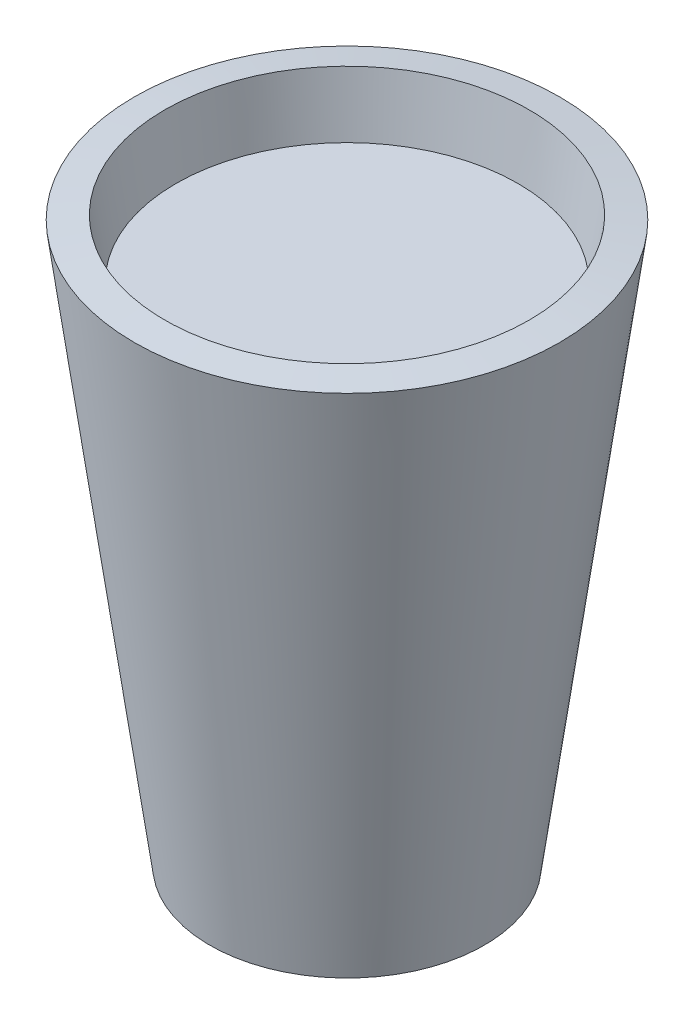
ISO-10303-21;
HEADER;
FILE_DESCRIPTION(('STEP AP214'),'2;1');
FILE_NAME('part.step','',(''),(''),'','','');
FILE_SCHEMA(('AUTOMOTIVE_DESIGN { 1 0 10303 214 1 1 1 1 }'));
ENDSEC;
DATA;
#1=APPLICATION_CONTEXT('core data for automotive mechanical design processes');
#2=APPLICATION_PROTOCOL_DEFINITION('international standard','automotive_design',2000,#1);
#3=PRODUCT_CONTEXT('',#1,'mechanical');
#4=PRODUCT('Part','Part','',(#3));
#5=PRODUCT_RELATED_PRODUCT_CATEGORY('part','',(#4));
#6=PRODUCT_DEFINITION_FORMATION('','',#4);
#7=PRODUCT_DEFINITION_CONTEXT('part definition',#1,'design');
#8=PRODUCT_DEFINITION('design','',#6,#7);
#9=PRODUCT_DEFINITION_SHAPE('','',#8);
#10=(LENGTH_UNIT() NAMED_UNIT(*) SI_UNIT(.MILLI.,.METRE.));
#11=(NAMED_UNIT(*) PLANE_ANGLE_UNIT() SI_UNIT($,.RADIAN.));
#12=(NAMED_UNIT(*) SI_UNIT($,.STERADIAN.) SOLID_ANGLE_UNIT());
#13=UNCERTAINTY_MEASURE_WITH_UNIT(LENGTH_MEASURE(1.E-05),#10,'distance_accuracy_value','');
#14=(GEOMETRIC_REPRESENTATION_CONTEXT(3) GLOBAL_UNCERTAINTY_ASSIGNED_CONTEXT((#13)) GLOBAL_UNIT_ASSIGNED_CONTEXT((#10,
#11,#12)) REPRESENTATION_CONTEXT('',''));
#15=CARTESIAN_POINT('',(0.,0.,0.));
#16=DIRECTION('',(0.,0.,1.));
#17=DIRECTION('',(1.,0.,0.));
#18=AXIS2_PLACEMENT_3D('',#15,#16,#17);
#19=CARTESIAN_POINT('',(0.,0.,0.));
#20=DIRECTION('',(0.,1.,0.));
#21=DIRECTION('',(-1.,0.,0.));
#22=AXIS2_PLACEMENT_3D('',#19,#20,#21);
#23=PLANE('',#22);
#24=CARTESIAN_POINT('',(0.,0.,0.));
#25=DIRECTION('',(0.,1.,0.));
#26=DIRECTION('',(-1.,0.,0.));
#27=AXIS2_PLACEMENT_3D('',#24,#25,#26);
#28=CIRCLE('',#27,28.575);
#29=CARTESIAN_POINT('',(-28.575,0.,0.));
#30=VERTEX_POINT('',#29);
#31=EDGE_CURVE('E10',#30,#30,#28,.T.);
#32=ORIENTED_EDGE('',*,*,#31,.F.);
#33=EDGE_LOOP('',(#32));
#34=FACE_BOUND('',#33,.T.);
#35=ADVANCED_FACE('F31',(#34),#23,.F.);
#36=CARTESIAN_POINT('',(0.,0.,0.));
#37=DIRECTION('',(0.,1.,0.));
#38=DIRECTION('',(-1.,0.,0.));
#39=AXIS2_PLACEMENT_3D('',#36,#37,#38);
#40=CONICAL_SURFACE('',#39,28.575,0.133853680848105);
#41=CARTESIAN_POINT('',(0.,116.424181846119,0.));
#42=DIRECTION('',(0.,1.,0.));
#43=DIRECTION('',(-1.,0.,0.));
#44=AXIS2_PLACEMENT_3D('',#41,#42,#43);
#45=CIRCLE('',#44,44.2525478459439);
#46=CARTESIAN_POINT('',(-44.2525478459439,116.424181846119,0.));
#47=VERTEX_POINT('',#46);
#48=EDGE_CURVE('E37',#47,#47,#45,.T.);
#49=ORIENTED_EDGE('',*,*,#48,.F.);
#50=EDGE_LOOP('',(#49));
#51=FACE_BOUND('',#50,.T.);
#52=ORIENTED_EDGE('',*,*,#31,.T.);
#53=EDGE_LOOP('',(#52));
#54=FACE_BOUND('',#53,.T.);
#55=ADVANCED_FACE('F70',(#51,#54),#40,.T.);
#56=CARTESIAN_POINT('',(0.,116.424181846119,0.));
#57=DIRECTION('',(0.,-1.,0.));
#58=DIRECTION('',(1.,0.,0.));
#59=AXIS2_PLACEMENT_3D('',#56,#57,#58);
#60=CONICAL_SURFACE('',#59,44.2525478459439,1.43694264594679);
#61=CARTESIAN_POINT('',(0.,117.279265620324,0.));
#62=DIRECTION('',(0.,1.,0.));
#63=DIRECTION('',(-1.,0.,0.));
#64=AXIS2_PLACEMENT_3D('',#61,#62,#63);
#65=CIRCLE('',#64,37.9025478459439);
#66=CARTESIAN_POINT('',(-37.9025478459439,117.279265620324,0.));
#67=VERTEX_POINT('',#66);
#68=EDGE_CURVE('E41',#67,#67,#65,.T.);
#69=ORIENTED_EDGE('',*,*,#68,.F.);
#70=EDGE_LOOP('',(#69));
#71=FACE_BOUND('',#70,.T.);
#72=ORIENTED_EDGE('',*,*,#48,.T.);
#73=EDGE_LOOP('',(#72));
#74=FACE_BOUND('',#73,.T.);
#75=ADVANCED_FACE('F65',(#71,#74),#60,.T.);
#76=CARTESIAN_POINT('',(0.,117.279265620324,0.));
#77=DIRECTION('',(0.,1.,0.));
#78=DIRECTION('',(-1.,0.,0.));
#79=AXIS2_PLACEMENT_3D('',#76,#77,#78);
#80=CONICAL_SURFACE('',#79,37.9025478459439,0.145324247951775);
#81=CARTESIAN_POINT('',(0.,10.16,0.));
#82=DIRECTION('',(0.,1.,0.));
#83=DIRECTION('',(-1.,0.,0.));
#84=AXIS2_PLACEMENT_3D('',#81,#82,#83);
#85=CIRCLE('',#84,22.225);
#86=CARTESIAN_POINT('',(-22.225,10.16,0.));
#87=VERTEX_POINT('',#86);
#88=EDGE_CURVE('E45',#87,#87,#85,.T.);
#89=ORIENTED_EDGE('',*,*,#88,.F.);
#90=EDGE_LOOP('',(#89));
#91=FACE_BOUND('',#90,.T.);
#92=ORIENTED_EDGE('',*,*,#68,.T.);
#93=EDGE_LOOP('',(#92));
#94=FACE_BOUND('',#93,.T.);
#95=ADVANCED_FACE('F59',(#91,#94),#80,.F.);
#96=CARTESIAN_POINT('',(0.,10.16,0.));
#97=DIRECTION('',(0.,1.,0.));
#98=DIRECTION('',(-1.,0.,0.));
#99=AXIS2_PLACEMENT_3D('',#96,#97,#98);
#100=CONICAL_SURFACE('',#99,22.225,0.139626340159547);
#101=CARTESIAN_POINT('',(0.,105.156,0.));
#102=DIRECTION('',(0.,1.,0.));
#103=DIRECTION('',(-1.,0.,0.));
#104=AXIS2_PLACEMENT_3D('',#101,#102,#103);
#105=CIRCLE('',#104,35.5758171333884);
#106=CARTESIAN_POINT('',(-35.5758171333884,105.156,0.));
#107=VERTEX_POINT('',#106);
#108=EDGE_CURVE('E50',#107,#107,#105,.T.);
#109=ORIENTED_EDGE('',*,*,#108,.F.);
#110=EDGE_LOOP('',(#109));
#111=FACE_BOUND('',#110,.T.);
#112=ORIENTED_EDGE('',*,*,#88,.T.);
#113=EDGE_LOOP('',(#112));
#114=FACE_BOUND('',#113,.T.);
#115=ADVANCED_FACE('F56',(#111,#114),#100,.T.);
#116=CARTESIAN_POINT('',(0.,105.156,0.));
#117=DIRECTION('',(0.,1.,0.));
#118=DIRECTION('',(-1.,0.,0.));
#119=AXIS2_PLACEMENT_3D('',#116,#117,#118);
#120=PLANE('',#119);
#121=ORIENTED_EDGE('',*,*,#108,.T.);
#122=EDGE_LOOP('',(#121));
#123=FACE_BOUND('',#122,.T.);
#124=ADVANCED_FACE('F54',(#123),#120,.T.);
#125=CLOSED_SHELL('',(#35,#55,#75,#95,#115,#124));
#126=MANIFOLD_SOLID_BREP('B2',#125);
#127=ADVANCED_BREP_SHAPE_REPRESENTATION('',(#18,#126),#14);
#128=SHAPE_DEFINITION_REPRESENTATION(#9,#127);
ENDSEC;
END-ISO-10303-21;
